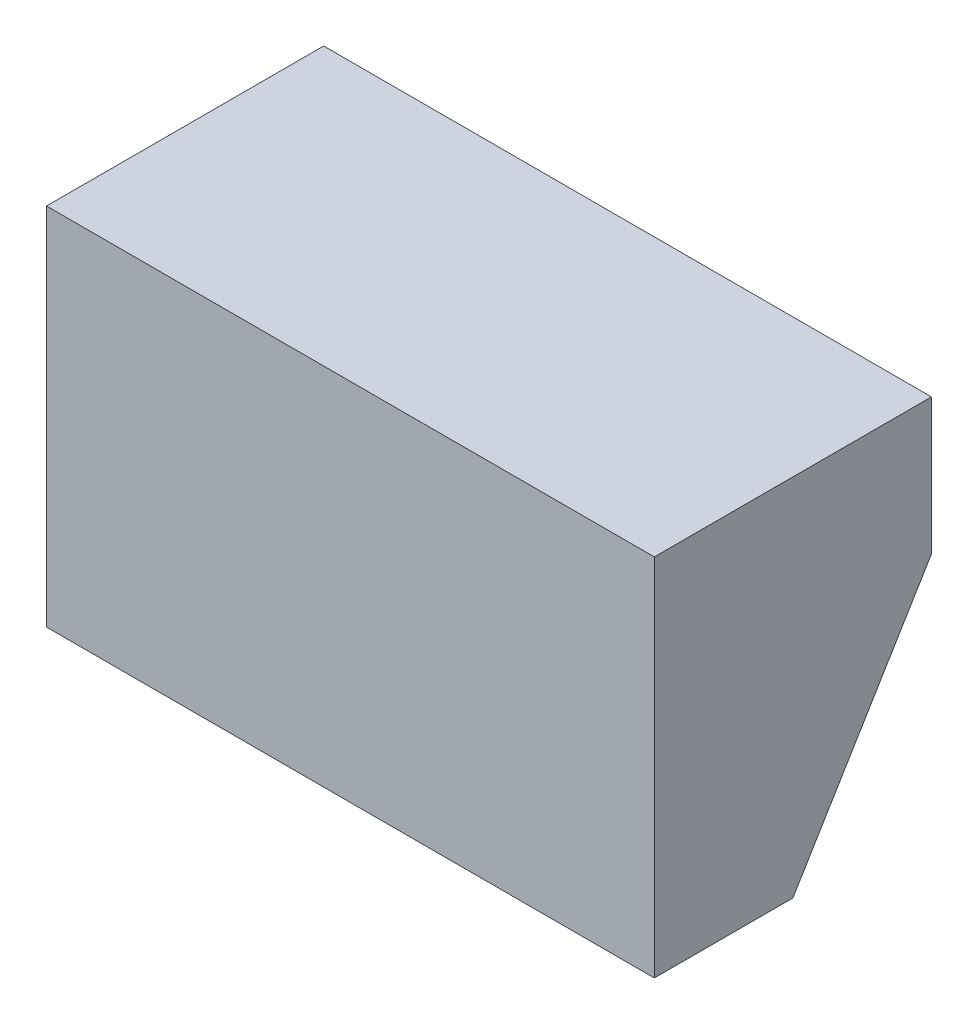
ISO-10303-21;
HEADER;
FILE_DESCRIPTION(('STEP AP214'),'2;1');
FILE_NAME('part.step','',(''),(''),'','','');
FILE_SCHEMA(('AUTOMOTIVE_DESIGN { 1 0 10303 214 1 1 1 1 }'));
ENDSEC;
DATA;
#1=APPLICATION_CONTEXT('core data for automotive mechanical design processes');
#2=APPLICATION_PROTOCOL_DEFINITION('international standard','automotive_design',2000,#1);
#3=PRODUCT_CONTEXT('',#1,'mechanical');
#4=PRODUCT('Part','Part','',(#3));
#5=PRODUCT_RELATED_PRODUCT_CATEGORY('part','',(#4));
#6=PRODUCT_DEFINITION_FORMATION('','',#4);
#7=PRODUCT_DEFINITION_CONTEXT('part definition',#1,'design');
#8=PRODUCT_DEFINITION('design','',#6,#7);
#9=PRODUCT_DEFINITION_SHAPE('','',#8);
#10=(LENGTH_UNIT() NAMED_UNIT(*) SI_UNIT(.MILLI.,.METRE.));
#11=(NAMED_UNIT(*) PLANE_ANGLE_UNIT() SI_UNIT($,.RADIAN.));
#12=(NAMED_UNIT(*) SI_UNIT($,.STERADIAN.) SOLID_ANGLE_UNIT());
#13=UNCERTAINTY_MEASURE_WITH_UNIT(LENGTH_MEASURE(1.E-05),#10,'distance_accuracy_value','');
#14=(GEOMETRIC_REPRESENTATION_CONTEXT(3) GLOBAL_UNCERTAINTY_ASSIGNED_CONTEXT((#13)) GLOBAL_UNIT_ASSIGNED_CONTEXT((#10,
#11,#12)) REPRESENTATION_CONTEXT('',''));
#15=CARTESIAN_POINT('',(0.,0.,0.));
#16=DIRECTION('',(0.,0.,1.));
#17=DIRECTION('',(1.,0.,0.));
#18=AXIS2_PLACEMENT_3D('',#15,#16,#17);
#19=CARTESIAN_POINT('',(125.,-75.,114.));
#20=DIRECTION('',(-1.,0.,0.));
#21=DIRECTION('',(0.,0.,1.));
#22=AXIS2_PLACEMENT_3D('',#19,#20,#21);
#23=PLANE('',#22);
#24=DIRECTION('',(0.,-0.855226725322334,0.518254038377355));
#25=VECTOR('',#24,1.);
#26=CARTESIAN_POINT('',(125.,-100.263808135213,72.3094731527829));
#27=LINE('',#26,#25);
#28=CARTESIAN_POINT('',(125.,19.0618301711685,0.));
#29=VERTEX_POINT('',#28);
#30=CARTESIAN_POINT('',(125.,-75.,56.9999999999999));
#31=VERTEX_POINT('',#30);
#32=EDGE_CURVE('E114',#29,#31,#27,.T.);
#33=ORIENTED_EDGE('',*,*,#32,.F.);
#34=DIRECTION('',(0.,1.,0.));
#35=VECTOR('',#34,1.);
#36=CARTESIAN_POINT('',(125.,-75.,0.));
#37=LINE('',#36,#35);
#38=CARTESIAN_POINT('',(125.,75.,0.));
#39=VERTEX_POINT('',#38);
#40=EDGE_CURVE('E122',#29,#39,#37,.T.);
#41=ORIENTED_EDGE('',*,*,#40,.T.);
#42=DIRECTION('',(0.,0.,-1.));
#43=VECTOR('',#42,1.);
#44=CARTESIAN_POINT('',(125.,75.,114.));
#45=LINE('',#44,#43);
#46=CARTESIAN_POINT('',(125.,75.,114.));
#47=VERTEX_POINT('',#46);
#48=EDGE_CURVE('E50',#47,#39,#45,.T.);
#49=ORIENTED_EDGE('',*,*,#48,.F.);
#50=DIRECTION('',(0.,1.,0.));
#51=VECTOR('',#50,1.);
#52=CARTESIAN_POINT('',(125.,-75.,114.));
#53=LINE('',#52,#51);
#54=CARTESIAN_POINT('',(125.,-75.,114.));
#55=VERTEX_POINT('',#54);
#56=EDGE_CURVE('E143',#55,#47,#53,.T.);
#57=ORIENTED_EDGE('',*,*,#56,.F.);
#58=DIRECTION('',(0.,0.,-1.));
#59=VECTOR('',#58,1.);
#60=CARTESIAN_POINT('',(125.,-75.,114.));
#61=LINE('',#60,#59);
#62=EDGE_CURVE('E125',#55,#31,#61,.T.);
#63=ORIENTED_EDGE('',*,*,#62,.T.);
#64=EDGE_LOOP('',(#33,#41,#49,#57,#63));
#65=FACE_BOUND('',#64,.T.);
#66=ADVANCED_FACE('F42',(#65),#23,.F.);
#67=CARTESIAN_POINT('',(-125.,-75.,114.));
#68=DIRECTION('',(0.,1.,0.));
#69=DIRECTION('',(0.,0.,1.));
#70=AXIS2_PLACEMENT_3D('',#67,#68,#69);
#71=PLANE('',#70);
#72=DIRECTION('',(-0.823397266330031,0.,-0.567465366168044));
#73=VECTOR('',#72,1.);
#74=CARTESIAN_POINT('',(-17.862546969277,-75.,-41.4573921273211));
#75=LINE('',#74,#73);
#76=CARTESIAN_POINT('',(42.292495755744,-75.,0.));
#77=VERTEX_POINT('',#76);
#78=EDGE_CURVE('E61',#31,#77,#75,.T.);
#79=ORIENTED_EDGE('',*,*,#78,.F.);
#80=ORIENTED_EDGE('',*,*,#62,.F.);
#81=DIRECTION('',(1.,0.,0.));
#82=VECTOR('',#81,1.);
#83=CARTESIAN_POINT('',(-125.,-75.,114.));
#84=LINE('',#83,#82);
#85=CARTESIAN_POINT('',(-125.,-75.,114.));
#86=VERTEX_POINT('',#85);
#87=EDGE_CURVE('E71',#86,#55,#84,.T.);
#88=ORIENTED_EDGE('',*,*,#87,.F.);
#89=DIRECTION('',(0.,0.,-1.));
#90=VECTOR('',#89,1.);
#91=CARTESIAN_POINT('',(-125.,-75.,114.));
#92=LINE('',#91,#90);
#93=CARTESIAN_POINT('',(-125.,-75.,0.));
#94=VERTEX_POINT('',#93);
#95=EDGE_CURVE('E146',#86,#94,#92,.T.);
#96=ORIENTED_EDGE('',*,*,#95,.T.);
#97=DIRECTION('',(1.,0.,0.));
#98=VECTOR('',#97,1.);
#99=CARTESIAN_POINT('',(-125.,-75.,0.));
#100=LINE('',#99,#98);
#101=EDGE_CURVE('E140',#94,#77,#100,.T.);
#102=ORIENTED_EDGE('',*,*,#101,.T.);
#103=EDGE_LOOP('',(#79,#80,#88,#96,#102));
#104=FACE_BOUND('',#103,.T.);
#105=ADVANCED_FACE('F172',(#104),#71,.F.);
#106=CARTESIAN_POINT('',(0.,0.,0.));
#107=DIRECTION('',(0.,0.,-1.));
#108=DIRECTION('',(-1.,0.,0.));
#109=AXIS2_PLACEMENT_3D('',#106,#107,#108);
#110=PLANE('',#109);
#111=CARTESIAN_POINT('',(-25.5219113985845,0.,0.));
#112=DIRECTION('',(0.,0.,-1.));
#113=DIRECTION('',(-1.,0.,0.));
#114=AXIS2_PLACEMENT_3D('',#111,#112,#113);
#115=CIRCLE('',#114,21.2566947196087);
#116=CARTESIAN_POINT('',(-46.7786061181932,0.,0.));
#117=VERTEX_POINT('',#116);
#118=EDGE_CURVE('E178',#117,#117,#115,.T.);
#119=ORIENTED_EDGE('',*,*,#118,.F.);
#120=EDGE_LOOP('',(#119));
#121=FACE_BOUND('',#120,.T.);
#122=ORIENTED_EDGE('',*,*,#40,.F.);
#123=DIRECTION('',(-0.66032679808164,-0.750978375011724,0.));
#124=VECTOR('',#123,1.);
#125=CARTESIAN_POINT('',(61.0434721622796,-53.6748351989157,0.));
#126=LINE('',#125,#124);
#127=EDGE_CURVE('E11',#29,#77,#126,.T.);
#128=ORIENTED_EDGE('',*,*,#127,.T.);
#129=ORIENTED_EDGE('',*,*,#101,.F.);
#130=DIRECTION('',(0.,-1.,0.));
#131=VECTOR('',#130,1.);
#132=CARTESIAN_POINT('',(-125.,-75.,0.));
#133=LINE('',#132,#131);
#134=CARTESIAN_POINT('',(-125.,75.,0.));
#135=VERTEX_POINT('',#134);
#136=EDGE_CURVE('E95',#135,#94,#133,.T.);
#137=ORIENTED_EDGE('',*,*,#136,.F.);
#138=DIRECTION('',(-1.,0.,0.));
#139=VECTOR('',#138,1.);
#140=CARTESIAN_POINT('',(-125.,75.,0.));
#141=LINE('',#140,#139);
#142=EDGE_CURVE('E129',#39,#135,#141,.T.);
#143=ORIENTED_EDGE('',*,*,#142,.F.);
#144=EDGE_LOOP('',(#122,#128,#129,#137,#143));
#145=FACE_BOUND('',#144,.T.);
#146=ADVANCED_FACE('F128',(#121,#145),#110,.T.);
#147=CARTESIAN_POINT('',(-125.,75.,114.));
#148=DIRECTION('',(0.,-1.,0.));
#149=DIRECTION('',(0.,0.,-1.));
#150=AXIS2_PLACEMENT_3D('',#147,#148,#149);
#151=PLANE('',#150);
#152=ORIENTED_EDGE('',*,*,#142,.T.);
#153=DIRECTION('',(0.,0.,-1.));
#154=VECTOR('',#153,1.);
#155=CARTESIAN_POINT('',(-125.,75.,114.));
#156=LINE('',#155,#154);
#157=CARTESIAN_POINT('',(-125.,75.,114.));
#158=VERTEX_POINT('',#157);
#159=EDGE_CURVE('E149',#158,#135,#156,.T.);
#160=ORIENTED_EDGE('',*,*,#159,.F.);
#161=DIRECTION('',(-1.,0.,0.));
#162=VECTOR('',#161,1.);
#163=CARTESIAN_POINT('',(-125.,75.,114.));
#164=LINE('',#163,#162);
#165=EDGE_CURVE('E105',#47,#158,#164,.T.);
#166=ORIENTED_EDGE('',*,*,#165,.F.);
#167=ORIENTED_EDGE('',*,*,#48,.T.);
#168=EDGE_LOOP('',(#152,#160,#166,#167));
#169=FACE_BOUND('',#168,.T.);
#170=ADVANCED_FACE('F153',(#169),#151,.F.);
#171=CARTESIAN_POINT('',(-125.,-75.,114.));
#172=DIRECTION('',(1.,0.,0.));
#173=DIRECTION('',(0.,0.,-1.));
#174=AXIS2_PLACEMENT_3D('',#171,#172,#173);
#175=PLANE('',#174);
#176=ORIENTED_EDGE('',*,*,#136,.T.);
#177=ORIENTED_EDGE('',*,*,#95,.F.);
#178=DIRECTION('',(0.,-1.,0.));
#179=VECTOR('',#178,1.);
#180=CARTESIAN_POINT('',(-125.,-75.,114.));
#181=LINE('',#180,#179);
#182=EDGE_CURVE('E158',#158,#86,#181,.T.);
#183=ORIENTED_EDGE('',*,*,#182,.F.);
#184=ORIENTED_EDGE('',*,*,#159,.T.);
#185=EDGE_LOOP('',(#176,#177,#183,#184));
#186=FACE_BOUND('',#185,.T.);
#187=ADVANCED_FACE('F170',(#186),#175,.F.);
#188=CARTESIAN_POINT('',(0.,0.,114.));
#189=DIRECTION('',(0.,0.,-1.));
#190=DIRECTION('',(-1.,0.,0.));
#191=AXIS2_PLACEMENT_3D('',#188,#189,#190);
#192=PLANE('',#191);
#193=ORIENTED_EDGE('',*,*,#56,.T.);
#194=ORIENTED_EDGE('',*,*,#165,.T.);
#195=ORIENTED_EDGE('',*,*,#182,.T.);
#196=ORIENTED_EDGE('',*,*,#87,.T.);
#197=EDGE_LOOP('',(#193,#194,#195,#196));
#198=FACE_BOUND('',#197,.T.);
#199=ADVANCED_FACE('F169',(#198),#192,.F.);
#200=CARTESIAN_POINT('',(27.9069349234818,-24.5382524923008,-40.4932094496149));
#201=DIRECTION('',(0.507766315458884,-0.446473182740372,-0.736773415629929));
#202=DIRECTION('',(-0.823397266330031,0.,-0.567465366168044));
#203=AXIS2_PLACEMENT_3D('',#200,#201,#202);
#204=PLANE('',#203);
#205=ORIENTED_EDGE('',*,*,#32,.T.);
#206=ORIENTED_EDGE('',*,*,#78,.T.);
#207=ORIENTED_EDGE('',*,*,#127,.F.);
#208=EDGE_LOOP('',(#205,#206,#207));
#209=FACE_BOUND('',#208,.T.);
#210=ADVANCED_FACE('F113',(#209),#204,.T.);
#211=CARTESIAN_POINT('',(-25.5219113985845,0.,54.));
#212=DIRECTION('',(0.,0.,-1.));
#213=DIRECTION('',(-1.,0.,0.));
#214=AXIS2_PLACEMENT_3D('',#211,#212,#213);
#215=CYLINDRICAL_SURFACE('',#214,21.2566947196087);
#216=CARTESIAN_POINT('',(-25.5219113985845,0.,54.));
#217=DIRECTION('',(0.,0.,-1.));
#218=DIRECTION('',(-1.,0.,0.));
#219=AXIS2_PLACEMENT_3D('',#216,#217,#218);
#220=CIRCLE('',#219,21.2566947196087);
#221=CARTESIAN_POINT('',(-46.7786061181932,0.,54.));
#222=VERTEX_POINT('',#221);
#223=EDGE_CURVE('E174',#222,#222,#220,.T.);
#224=ORIENTED_EDGE('',*,*,#223,.F.);
#225=EDGE_LOOP('',(#224));
#226=FACE_BOUND('',#225,.T.);
#227=ORIENTED_EDGE('',*,*,#118,.T.);
#228=EDGE_LOOP('',(#227));
#229=FACE_BOUND('',#228,.T.);
#230=ADVANCED_FACE('F185',(#226,#229),#215,.F.);
#231=CARTESIAN_POINT('',(-25.5219113985845,0.,54.));
#232=DIRECTION('',(0.,0.,-1.));
#233=DIRECTION('',(-1.,0.,0.));
#234=AXIS2_PLACEMENT_3D('',#231,#232,#233);
#235=PLANE('',#234);
#236=ORIENTED_EDGE('',*,*,#223,.T.);
#237=EDGE_LOOP('',(#236));
#238=FACE_BOUND('',#237,.T.);
#239=ADVANCED_FACE('F237',(#238),#235,.T.);
#240=CLOSED_SHELL('',(#66,#105,#146,#170,#187,#199,#210,#230,#239));
#241=MANIFOLD_SOLID_BREP('B2',#240);
#242=ADVANCED_BREP_SHAPE_REPRESENTATION('',(#18,#241),#14);
#243=SHAPE_DEFINITION_REPRESENTATION(#9,#242);
ENDSEC;
END-ISO-10303-21;
